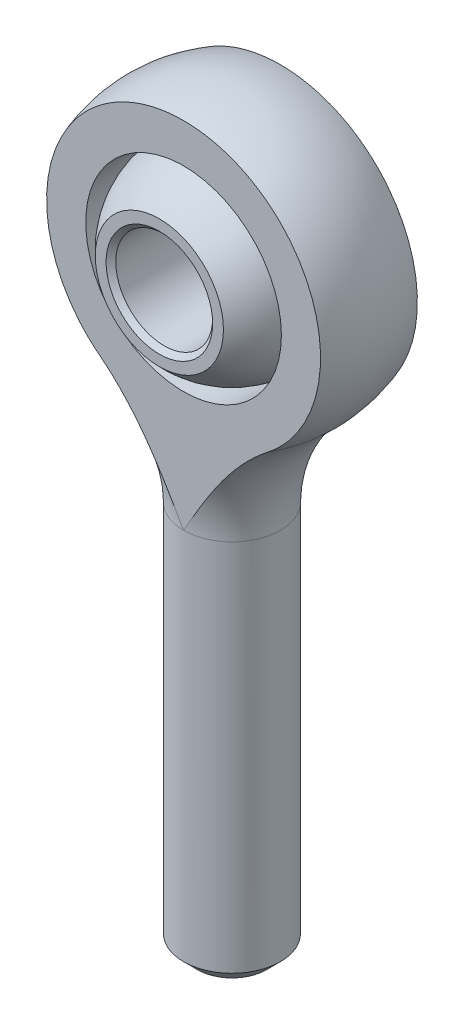
ISO-10303-21;
HEADER;
FILE_DESCRIPTION(('STEP AP214'),'2;1');
FILE_NAME('part.step','',(''),(''),'','','');
FILE_SCHEMA(('AUTOMOTIVE_DESIGN { 1 0 10303 214 1 1 1 1 }'));
ENDSEC;
DATA;
#1=APPLICATION_CONTEXT('core data for automotive mechanical design processes');
#2=APPLICATION_PROTOCOL_DEFINITION('international standard','automotive_design',2000,#1);
#3=PRODUCT_CONTEXT('',#1,'mechanical');
#4=PRODUCT('Part','Part','',(#3));
#5=PRODUCT_RELATED_PRODUCT_CATEGORY('part','',(#4));
#6=PRODUCT_DEFINITION_FORMATION('','',#4);
#7=PRODUCT_DEFINITION_CONTEXT('part definition',#1,'design');
#8=PRODUCT_DEFINITION('design','',#6,#7);
#9=PRODUCT_DEFINITION_SHAPE('','',#8);
#10=(LENGTH_UNIT() NAMED_UNIT(*) SI_UNIT(.MILLI.,.METRE.));
#11=(NAMED_UNIT(*) PLANE_ANGLE_UNIT() SI_UNIT($,.RADIAN.));
#12=(NAMED_UNIT(*) SI_UNIT($,.STERADIAN.) SOLID_ANGLE_UNIT());
#13=UNCERTAINTY_MEASURE_WITH_UNIT(LENGTH_MEASURE(1.E-05),#10,'distance_accuracy_value','');
#14=(GEOMETRIC_REPRESENTATION_CONTEXT(3) GLOBAL_UNCERTAINTY_ASSIGNED_CONTEXT((#13)) GLOBAL_UNIT_ASSIGNED_CONTEXT((#10,
#11,#12)) REPRESENTATION_CONTEXT('',''));
#15=CARTESIAN_POINT('',(0.,0.,0.));
#16=DIRECTION('',(0.,0.,1.));
#17=DIRECTION('',(1.,0.,0.));
#18=AXIS2_PLACEMENT_3D('',#15,#16,#17);
#19=CARTESIAN_POINT('',(0.,14.2875,0.));
#20=DIRECTION('',(0.,-1.,0.));
#21=DIRECTION('',(-1.,0.,0.));
#22=AXIS2_PLACEMENT_3D('',#19,#20,#21);
#23=SPHERICAL_SURFACE('',#22,6.35);
#24=CARTESIAN_POINT('',(0.,14.2875,0.));
#25=DIRECTION('',(0.,0.,1.));
#26=DIRECTION('',(0.,-1.,0.));
#27=AXIS2_PLACEMENT_3D('',#24,#25,#26);
#28=SPHERICAL_SURFACE('',#27,6.35);
#29=CARTESIAN_POINT('',(0.,14.2875,-4.7625));
#30=DIRECTION('',(0.,0.,1.));
#31=DIRECTION('',(0.,-1.,0.));
#32=AXIS2_PLACEMENT_3D('',#29,#30,#31);
#33=CIRCLE('',#32,4.20013020631504);
#34=CARTESIAN_POINT('',(0.,10.087369793685,-4.7625));
#35=VERTEX_POINT('',#34);
#36=EDGE_CURVE('E70',#35,#35,#33,.F.);
#37=ORIENTED_EDGE('',*,*,#36,.F.);
#38=EDGE_LOOP('',(#37));
#39=FACE_BOUND('',#38,.T.);
#40=CARTESIAN_POINT('',(0.,14.2875,4.7625));
#41=DIRECTION('',(0.,0.,-1.));
#42=DIRECTION('',(0.,1.,0.));
#43=AXIS2_PLACEMENT_3D('',#40,#41,#42);
#44=CIRCLE('',#43,4.20013020631504);
#45=CARTESIAN_POINT('',(0.,18.487630206315,4.7625));
#46=VERTEX_POINT('',#45);
#47=EDGE_CURVE('E69',#46,#46,#44,.F.);
#48=ORIENTED_EDGE('',*,*,#47,.F.);
#49=EDGE_LOOP('',(#48));
#50=FACE_BOUND('',#49,.T.);
#51=ADVANCED_FACE('F49',(#39,#50),#28,.T.);
#52=CARTESIAN_POINT('',(-9.525,23.8125,4.7625));
#53=DIRECTION('',(0.,0.,-1.));
#54=DIRECTION('',(0.,1.,0.));
#55=AXIS2_PLACEMENT_3D('',#52,#53,#54);
#56=PLANE('',#55);
#57=CARTESIAN_POINT('',(0.,14.2875,4.7625));
#58=DIRECTION('',(0.,0.,-1.));
#59=DIRECTION('',(0.,1.,0.));
#60=AXIS2_PLACEMENT_3D('',#57,#58,#59);
#61=CIRCLE('',#60,3.4925);
#62=CARTESIAN_POINT('',(0.,17.78,4.7625));
#63=VERTEX_POINT('',#62);
#64=EDGE_CURVE('E11',#63,#63,#61,.T.);
#65=ORIENTED_EDGE('',*,*,#64,.T.);
#66=EDGE_LOOP('',(#65));
#67=FACE_BOUND('',#66,.T.);
#68=ORIENTED_EDGE('',*,*,#47,.T.);
#69=EDGE_LOOP('',(#68));
#70=FACE_BOUND('',#69,.T.);
#71=ADVANCED_FACE('F76',(#67,#70),#56,.F.);
#72=CARTESIAN_POINT('',(-9.525,23.8125,-4.7625));
#73=DIRECTION('',(0.,0.,1.));
#74=DIRECTION('',(0.,-1.,0.));
#75=AXIS2_PLACEMENT_3D('',#72,#73,#74);
#76=PLANE('',#75);
#77=CARTESIAN_POINT('',(0.,14.2875,-4.7625));
#78=DIRECTION('',(0.,0.,1.));
#79=DIRECTION('',(0.,-1.,0.));
#80=AXIS2_PLACEMENT_3D('',#77,#78,#79);
#81=CIRCLE('',#80,3.4925);
#82=CARTESIAN_POINT('',(0.,10.795,-4.7625));
#83=VERTEX_POINT('',#82);
#84=EDGE_CURVE('E64',#83,#83,#81,.T.);
#85=ORIENTED_EDGE('',*,*,#84,.T.);
#86=EDGE_LOOP('',(#85));
#87=FACE_BOUND('',#86,.T.);
#88=ORIENTED_EDGE('',*,*,#36,.T.);
#89=EDGE_LOOP('',(#88));
#90=FACE_BOUND('',#89,.T.);
#91=ADVANCED_FACE('F84',(#87,#90),#76,.F.);
#92=CARTESIAN_POINT('',(0.,14.2875,-4.7625));
#93=DIRECTION('',(0.,0.,1.));
#94=DIRECTION('',(1.,0.,0.));
#95=AXIS2_PLACEMENT_3D('',#92,#93,#94);
#96=CYLINDRICAL_SURFACE('',#95,3.175);
#97=CARTESIAN_POINT('',(0.,14.2875,-4.445));
#98=DIRECTION('',(0.,0.,1.));
#99=DIRECTION('',(1.,0.,0.));
#100=AXIS2_PLACEMENT_3D('',#97,#98,#99);
#101=CIRCLE('',#100,3.175);
#102=CARTESIAN_POINT('',(3.175,14.2875,-4.445));
#103=VERTEX_POINT('',#102);
#104=EDGE_CURVE('E56',#103,#103,#101,.F.);
#105=ORIENTED_EDGE('',*,*,#104,.T.);
#106=EDGE_LOOP('',(#105));
#107=FACE_BOUND('',#106,.T.);
#108=CARTESIAN_POINT('',(0.,14.2875,4.445));
#109=DIRECTION('',(0.,0.,-1.));
#110=DIRECTION('',(-1.,0.,0.));
#111=AXIS2_PLACEMENT_3D('',#108,#109,#110);
#112=CIRCLE('',#111,3.175);
#113=CARTESIAN_POINT('',(-3.175,14.2875,4.445));
#114=VERTEX_POINT('',#113);
#115=EDGE_CURVE('E60',#114,#114,#112,.F.);
#116=ORIENTED_EDGE('',*,*,#115,.T.);
#117=EDGE_LOOP('',(#116));
#118=FACE_BOUND('',#117,.T.);
#119=ADVANCED_FACE('F90',(#107,#118),#96,.F.);
#120=CARTESIAN_POINT('',(0.,14.2875,-4.7625));
#121=DIRECTION('',(0.,0.,-1.));
#122=DIRECTION('',(-1.,0.,0.));
#123=AXIS2_PLACEMENT_3D('',#120,#121,#122);
#124=CONICAL_SURFACE('',#123,3.4925,0.785398163397446);
#125=ORIENTED_EDGE('',*,*,#104,.F.);
#126=EDGE_LOOP('',(#125));
#127=FACE_BOUND('',#126,.T.);
#128=ORIENTED_EDGE('',*,*,#84,.F.);
#129=EDGE_LOOP('',(#128));
#130=FACE_BOUND('',#129,.T.);
#131=ADVANCED_FACE('F88',(#127,#130),#124,.F.);
#132=CARTESIAN_POINT('',(0.,14.2875,4.445));
#133=DIRECTION('',(0.,0.,1.));
#134=DIRECTION('',(1.,0.,0.));
#135=AXIS2_PLACEMENT_3D('',#132,#133,#134);
#136=CONICAL_SURFACE('',#135,3.175,0.785398163397446);
#137=ORIENTED_EDGE('',*,*,#64,.F.);
#138=EDGE_LOOP('',(#137));
#139=FACE_BOUND('',#138,.T.);
#140=ORIENTED_EDGE('',*,*,#115,.F.);
#141=EDGE_LOOP('',(#140));
#142=FACE_BOUND('',#141,.T.);
#143=ADVANCED_FACE('F51',(#139,#142),#136,.F.);
#144=CLOSED_SHELL('',(#51,#71,#91,#119,#131,#143));
#145=MANIFOLD_SOLID_BREP('B2',#144);
#146=CARTESIAN_POINT('',(0.,0.,0.));
#147=DIRECTION('',(0.,-1.,0.));
#148=DIRECTION('',(1.,0.,0.));
#149=AXIS2_PLACEMENT_3D('',#146,#147,#148);
#150=TOROIDAL_SURFACE('',#149,12.8984375,9.72343750000001);
#151=CARTESIAN_POINT('',(0.,0.,-3.17500000000002));
#152=CARTESIAN_POINT('',(-0.00326153281441982,0.005707684580339,-3.17500000000001));
#153=CARTESIAN_POINT('',(-0.00652306728251784,0.0114153698422848,-3.17500000000001));
#154=CARTESIAN_POINT('',(-0.273129494536175,0.477974240188255,-3.17499999999953));
#155=CARTESIAN_POINT('',(-0.536560192717342,0.938786382521938,-3.17499999999987));
#156=CARTESIAN_POINT('',(-1.07566265442385,1.8532278541255,-3.17500000000012));
#157=CARTESIAN_POINT('',(-1.35133223128925,2.30685844699647,-3.17500000000003));
#158=CARTESIAN_POINT('',(-1.92559609450498,3.19894900735654,-3.17499999999996));
#159=CARTESIAN_POINT('',(-2.22416629507254,3.63742422890326,-3.17499999999998));
#160=CARTESIAN_POINT('',(-2.85309895646081,4.49102276291093,-3.175));
#161=CARTESIAN_POINT('',(-3.18344395182661,4.90615870752533,-3.17499999999999));
#162=CARTESIAN_POINT('',(-3.77466960931411,5.58162755367697,-3.17499999999999));
#163=CARTESIAN_POINT('',(-4.02585009176844,5.85044049930275,-3.17499999999999));
#164=CARTESIAN_POINT('',(-4.54711374431235,6.36901465439249,-3.17499999999999));
#165=CARTESIAN_POINT('',(-4.8171908837647,6.61878188936269,-3.17499999999999));
#166=CARTESIAN_POINT('',(-5.37662445754767,7.09612768098667,-3.17499999999999));
#167=CARTESIAN_POINT('',(-5.66599147564323,7.32369388511259,-3.17499999999998));
#168=CARTESIAN_POINT('',(-6.26322715779345,7.75319037776599,-3.17499999999998));
#169=CARTESIAN_POINT('',(-6.57109562059138,7.95512094508084,-3.17499999999998));
#170=CARTESIAN_POINT('',(-7.20718830556185,8.33213779588148,-3.17499999999998));
#171=CARTESIAN_POINT('',(-7.5355887374278,8.50692791175216,-3.17499999999998));
#172=CARTESIAN_POINT('',(-8.20771747693342,8.8241919306929,-3.17499999999998));
#173=CARTESIAN_POINT('',(-8.55144656933277,8.96666417695288,-3.17499999999998));
#174=CARTESIAN_POINT('',(-9.25110720245967,9.21656726408625,-3.17499999999998));
#175=CARTESIAN_POINT('',(-9.60702765373211,9.32402906223354,-3.17499999999998));
#176=CARTESIAN_POINT('',(-10.3280020283619,9.50191139492481,-3.17499999999998));
#177=CARTESIAN_POINT('',(-10.6930544049571,9.57233815853922,-3.17499999999998));
#178=CARTESIAN_POINT('',(-11.3741481179293,9.66696888097472,-3.17499999999998));
#179=CARTESIAN_POINT('',(-11.6894621097035,9.69646466999952,-3.17499999999998));
#180=CARTESIAN_POINT('',(-12.3214131947063,9.72667494727439,-3.17499999999998));
#181=CARTESIAN_POINT('',(-12.6380499893941,9.72739561225201,-3.17499999999998));
#182=CARTESIAN_POINT('',(-13.2714560118642,9.69958458822556,-3.17499999999998));
#183=CARTESIAN_POINT('',(-13.5882199940049,9.67092754783703,-3.17499999999998));
#184=CARTESIAN_POINT('',(-14.0603016310326,9.60580647491024,-3.17499999999998));
#185=CARTESIAN_POINT('',(-14.2172131666163,9.58039570300526,-3.17499999999998));
#186=CARTESIAN_POINT('',(-14.5296709919222,9.5222100530854,-3.17499999999998));
#187=CARTESIAN_POINT('',(-14.6852172275902,9.48943488485749,-3.17499999999998));
#188=CARTESIAN_POINT('',(-14.8399244090465,9.45298870970035,-3.17499999999998));
#189=B_SPLINE_CURVE_WITH_KNOTS('',3,(#151,#152,#153,#154,#155,#156,#157,#158,#159,#160,#161,
#162,#163,#164,#165,#166,#167,#168,#169,#170,#171,#172,#173,#174,#175,#176,#177,#178,#179,#180,
#181,#182,#183,#184,#185,#186,#187,#188),.UNSPECIFIED.,.F.,.F.,(4,2,2,2,2,2,2,2,2,2,2,2,2,2,2,2,
2,2,4),(0.,0.0197214984217777,1.6120807750934,3.20415668878455,4.79458050768029,
6.38413507018251,7.48699761805494,8.58950979223067,9.692631940663,10.7957420916219,
11.9101519429451,13.0246189127738,14.1380977463547,15.2513892395329,16.2001992988048,
17.1488056900493,18.1014765943213,18.5781908799006,19.0549239549309),.UNSPECIFIED.);
#190=CARTESIAN_POINT('',(0.,0.,-3.175));
#191=VERTEX_POINT('',#190);
#192=CARTESIAN_POINT('',(-5.53702467552869,7.21739690721651,-3.17499999999999));
#193=VERTEX_POINT('',#192);
#194=EDGE_CURVE('E143',#191,#193,#189,.T.);
#195=ORIENTED_EDGE('',*,*,#194,.F.);
#196=CARTESIAN_POINT('',(0.,0.,0.));
#197=DIRECTION('',(0.,1.,0.));
#198=DIRECTION('',(-1.,0.,0.));
#199=AXIS2_PLACEMENT_3D('',#196,#197,#198);
#200=CIRCLE('',#199,3.175);
#201=CARTESIAN_POINT('',(0.,0.,3.175));
#202=VERTEX_POINT('',#201);
#203=EDGE_CURVE('E171',#191,#202,#200,.T.);
#204=ORIENTED_EDGE('',*,*,#203,.T.);
#205=CARTESIAN_POINT('',(0.,0.,3.17500000000002));
#206=CARTESIAN_POINT('',(-0.00326153281468181,0.00570768458021034,3.17500000000001));
#207=CARTESIAN_POINT('',(-0.00652306728303626,0.0114153698420096,3.175));
#208=CARTESIAN_POINT('',(-0.273129494558281,0.477974240178135,3.17499999999949));
#209=CARTESIAN_POINT('',(-0.536560192725134,0.938786382522493,3.17499999999986));
#210=CARTESIAN_POINT('',(-1.07566265442257,1.853227854136,3.17500000000013));
#211=CARTESIAN_POINT('',(-1.35133223129322,2.30685844700624,3.17500000000003));
#212=CARTESIAN_POINT('',(-1.92559609451397,3.19894900736693,3.17499999999996));
#213=CARTESIAN_POINT('',(-2.22416629508128,3.63742422891501,3.17499999999999));
#214=CARTESIAN_POINT('',(-2.85309895647092,4.49102276292478,3.17500000000001));
#215=CARTESIAN_POINT('',(-3.18344395183838,4.90615870753989,3.175));
#216=CARTESIAN_POINT('',(-3.77466960932724,5.58162755369122,3.175));
#217=CARTESIAN_POINT('',(-4.02585009178125,5.85044049931608,3.175));
#218=CARTESIAN_POINT('',(-4.54711374432451,6.36901465440402,3.175));
#219=CARTESIAN_POINT('',(-4.81719088377654,6.61878188937333,3.175));
#220=CARTESIAN_POINT('',(-5.37662445755933,7.0961276809961,3.175));
#221=CARTESIAN_POINT('',(-5.66599147565507,7.32369388512163,3.175));
#222=CARTESIAN_POINT('',(-6.26322715780569,7.75319037777427,3.175));
#223=CARTESIAN_POINT('',(-6.57109562060384,7.95512094508875,3.175));
#224=CARTESIAN_POINT('',(-7.20718830557456,8.33213779588849,3.175));
#225=CARTESIAN_POINT('',(-7.53558873744053,8.50692791175866,3.175));
#226=CARTESIAN_POINT('',(-8.2077174769461,8.82419193069839,3.175));
#227=CARTESIAN_POINT('',(-8.5514465693454,8.96666417695786,3.175));
#228=CARTESIAN_POINT('',(-9.25110720247167,9.21656726409007,3.175));
#229=CARTESIAN_POINT('',(-9.60702765374351,9.32402906223675,3.175));
#230=CARTESIAN_POINT('',(-10.328002028372,9.50191139492693,3.175));
#231=CARTESIAN_POINT('',(-10.6930544049666,9.57233815854086,3.175));
#232=CARTESIAN_POINT('',(-11.3741481179378,9.66696888097564,3.175));
#233=CARTESIAN_POINT('',(-11.6894621097117,9.69646467000015,3.175));
#234=CARTESIAN_POINT('',(-12.3214131947137,9.72667494727451,3.175));
#235=CARTESIAN_POINT('',(-12.6380499894011,9.72739561225191,3.175));
#236=CARTESIAN_POINT('',(-13.2714560118709,9.69958458822505,3.175));
#237=CARTESIAN_POINT('',(-13.5882199940118,9.67092754783631,3.175));
#238=CARTESIAN_POINT('',(-14.0603016310397,9.60580647490916,3.175));
#239=CARTESIAN_POINT('',(-14.2172131666234,9.58039570300406,3.175));
#240=CARTESIAN_POINT('',(-14.5296709919294,9.52221005308395,3.175));
#241=CARTESIAN_POINT('',(-14.6852172275975,9.48943488485591,3.175));
#242=CARTESIAN_POINT('',(-14.8399244090537,9.45298870969864,3.175));
#243=B_SPLINE_CURVE_WITH_KNOTS('',3,(#205,#206,#207,#208,#209,#210,#211,#212,#213,#214,#215,
#216,#217,#218,#219,#220,#221,#222,#223,#224,#225,#226,#227,#228,#229,#230,#231,#232,#233,#234,
#235,#236,#237,#238,#239,#240,#241,#242),.UNSPECIFIED.,.F.,.F.,(4,2,2,2,2,2,2,2,2,2,2,2,2,2,2,2,
2,2,4),(0.,0.0197214984217777,1.61208077509989,3.20415668879695,4.79458050769593,
6.38413507020272,7.48699761807251,8.58950979224571,9.69263194067777,10.7957420916366,
11.9101519429592,13.0246189127871,14.1380977463658,15.2513892395418,16.2001992988125,
17.1488056900559,18.1014765943283,18.5781908799078,19.0549239549384),.UNSPECIFIED.);
#244=CARTESIAN_POINT('',(-5.53702467552869,7.21739690721651,3.175));
#245=VERTEX_POINT('',#244);
#246=EDGE_CURVE('E175',#245,#202,#243,.F.);
#247=ORIENTED_EDGE('',*,*,#246,.F.);
#248=CARTESIAN_POINT('',(0.,7.21739690721651,0.));
#249=DIRECTION('',(0.,-1.,0.));
#250=DIRECTION('',(1.,0.,0.));
#251=AXIS2_PLACEMENT_3D('',#248,#249,#250);
#252=CIRCLE('',#251,6.38273195876291);
#253=EDGE_CURVE('E174',#245,#193,#252,.T.);
#254=ORIENTED_EDGE('',*,*,#253,.T.);
#255=EDGE_LOOP('',(#195,#204,#247,#254));
#256=FACE_BOUND('',#255,.T.);
#257=ADVANCED_FACE('F129',(#256),#150,.F.);
#258=CARTESIAN_POINT('',(0.,-25.4,0.));
#259=DIRECTION('',(0.,1.,0.));
#260=DIRECTION('',(-1.,0.,0.));
#261=AXIS2_PLACEMENT_3D('',#258,#259,#260);
#262=PLANE('',#261);
#263=CARTESIAN_POINT('',(0.,-25.4,0.));
#264=DIRECTION('',(0.,1.,0.));
#265=DIRECTION('',(-1.,0.,0.));
#266=AXIS2_PLACEMENT_3D('',#263,#264,#265);
#267=CIRCLE('',#266,2.26822);
#268=CARTESIAN_POINT('',(-2.26822,-25.4,0.));
#269=VERTEX_POINT('',#268);
#270=EDGE_CURVE('E186',#269,#269,#267,.F.);
#271=ORIENTED_EDGE('',*,*,#270,.T.);
#272=EDGE_LOOP('',(#271));
#273=FACE_BOUND('',#272,.T.);
#274=ADVANCED_FACE('F223',(#273),#262,.F.);
#275=CARTESIAN_POINT('',(0.,23.8125,0.));
#276=DIRECTION('',(0.,1.,0.));
#277=DIRECTION('',(-1.,0.,0.));
#278=AXIS2_PLACEMENT_3D('',#275,#276,#277);
#279=CYLINDRICAL_SURFACE('',#278,3.175);
#280=CARTESIAN_POINT('',(0.,-24.49322,0.));
#281=DIRECTION('',(0.,1.,0.));
#282=DIRECTION('',(-1.,0.,0.));
#283=AXIS2_PLACEMENT_3D('',#280,#281,#282);
#284=CIRCLE('',#283,3.175);
#285=CARTESIAN_POINT('',(-3.175,-24.49322,0.));
#286=VERTEX_POINT('',#285);
#287=EDGE_CURVE('E184',#286,#286,#284,.T.);
#288=ORIENTED_EDGE('',*,*,#287,.T.);
#289=EDGE_LOOP('',(#288));
#290=FACE_BOUND('',#289,.T.);
#291=EDGE_CURVE('E180',#202,#191,#200,.T.);
#292=ORIENTED_EDGE('',*,*,#291,.F.);
#293=ORIENTED_EDGE('',*,*,#203,.F.);
#294=EDGE_LOOP('',(#292,#293));
#295=FACE_BOUND('',#294,.T.);
#296=ADVANCED_FACE('F179',(#290,#295),#279,.T.);
#297=CARTESIAN_POINT('',(0.,-24.49322,0.));
#298=DIRECTION('',(0.,1.,0.));
#299=DIRECTION('',(-1.,0.,0.));
#300=AXIS2_PLACEMENT_3D('',#297,#298,#299);
#301=CONICAL_SURFACE('',#300,3.175,0.785398163397451);
#302=ORIENTED_EDGE('',*,*,#270,.F.);
#303=EDGE_LOOP('',(#302));
#304=FACE_BOUND('',#303,.T.);
#305=ORIENTED_EDGE('',*,*,#287,.F.);
#306=EDGE_LOOP('',(#305));
#307=FACE_BOUND('',#306,.T.);
#308=ADVANCED_FACE('F131',(#304,#307),#301,.T.);
#309=CARTESIAN_POINT('',(0.,0.,-3.17500000000002));
#310=CARTESIAN_POINT('',(0.00326153281435391,0.005707684580339,-3.17500000000001));
#311=CARTESIAN_POINT('',(0.00652306728245195,0.0114153698422848,-3.17500000000001));
#312=CARTESIAN_POINT('',(0.273129494536111,0.477974240188253,-3.17499999999953));
#313=CARTESIAN_POINT('',(0.536560192717282,0.938786382521935,-3.17499999999987));
#314=CARTESIAN_POINT('',(1.07566265442379,1.8532278541255,-3.17500000000012));
#315=CARTESIAN_POINT('',(1.35133223128919,2.30685844699646,-3.17500000000003));
#316=CARTESIAN_POINT('',(1.92559609450492,3.19894900735654,-3.17499999999996));
#317=CARTESIAN_POINT('',(2.22416629507248,3.63742422890325,-3.17499999999998));
#318=CARTESIAN_POINT('',(2.85309895646076,4.49102276291092,-3.175));
#319=CARTESIAN_POINT('',(3.18344395182656,4.90615870752532,-3.17499999999999));
#320=CARTESIAN_POINT('',(3.77466960931405,5.58162755367696,-3.17499999999999));
#321=CARTESIAN_POINT('',(4.02585009176839,5.85044049930274,-3.17499999999999));
#322=CARTESIAN_POINT('',(4.54711374431229,6.36901465439248,-3.17499999999999));
#323=CARTESIAN_POINT('',(4.81719088376465,6.61878188936267,-3.17499999999999));
#324=CARTESIAN_POINT('',(5.37662445754762,7.09612768098666,-3.17499999999999));
#325=CARTESIAN_POINT('',(5.66599147564318,7.32369388511257,-3.17499999999998));
#326=CARTESIAN_POINT('',(6.2632271577934,7.75319037776597,-3.17499999999998));
#327=CARTESIAN_POINT('',(6.57109562059133,7.95512094508082,-3.17499999999998));
#328=CARTESIAN_POINT('',(7.2071883055618,8.33213779588146,-3.17499999999998));
#329=CARTESIAN_POINT('',(7.53558873742776,8.50692791175213,-3.17499999999998));
#330=CARTESIAN_POINT('',(8.20771747693337,8.82419193069288,-3.17499999999998));
#331=CARTESIAN_POINT('',(8.55144656933273,8.96666417695286,-3.17499999999998));
#332=CARTESIAN_POINT('',(9.25110720245962,9.21656726408623,-3.17499999999998));
#333=CARTESIAN_POINT('',(9.60702765373206,9.32402906223352,-3.17499999999998));
#334=CARTESIAN_POINT('',(10.3280020283618,9.50191139492478,-3.17499999999998));
#335=CARTESIAN_POINT('',(10.6930544049571,9.57233815853919,-3.17499999999998));
#336=CARTESIAN_POINT('',(11.3741481179293,9.6669688809747,-3.17499999999998));
#337=CARTESIAN_POINT('',(11.6894621097035,9.69646466999949,-3.17499999999998));
#338=CARTESIAN_POINT('',(12.3214131947063,9.72667494727436,-3.17499999999998));
#339=CARTESIAN_POINT('',(12.638049989394,9.72739561225198,-3.17499999999998));
#340=CARTESIAN_POINT('',(13.2714560118641,9.69958458822553,-3.17499999999998));
#341=CARTESIAN_POINT('',(13.5882199940049,9.670927547837,-3.17499999999998));
#342=CARTESIAN_POINT('',(14.0603016310326,9.60580647491021,-3.17499999999998));
#343=CARTESIAN_POINT('',(14.2172131666163,9.58039570300523,-3.17499999999998));
#344=CARTESIAN_POINT('',(14.5296709919222,9.52221005308536,-3.17499999999998));
#345=CARTESIAN_POINT('',(14.6852172275902,9.48943488485746,-3.17499999999998));
#346=CARTESIAN_POINT('',(14.8399244090464,9.45298870970032,-3.17499999999998));
#347=B_SPLINE_CURVE_WITH_KNOTS('',3,(#309,#310,#311,#312,#313,#314,#315,#316,#317,#318,#319,
#320,#321,#322,#323,#324,#325,#326,#327,#328,#329,#330,#331,#332,#333,#334,#335,#336,#337,#338,
#339,#340,#341,#342,#343,#344,#345,#346),.UNSPECIFIED.,.F.,.F.,(4,2,2,2,2,2,2,2,2,2,2,2,2,2,2,2,
2,2,4),(0.,0.0197214984217777,1.6120807750934,3.20415668878455,4.79458050768028,
6.38413507018251,7.48699761805494,8.58950979223066,9.692631940663,10.7957420916219,
11.9101519429451,13.0246189127738,14.1380977463547,15.2513892395329,16.2001992988048,
17.1488056900493,18.1014765943213,18.5781908799006,19.0549239549309),.UNSPECIFIED.);
#348=CARTESIAN_POINT('',(5.53702467552866,7.2173969072165,-3.17499999999999));
#349=VERTEX_POINT('',#348);
#350=EDGE_CURVE('E162',#349,#191,#347,.F.);
#351=ORIENTED_EDGE('',*,*,#350,.F.);
#352=CARTESIAN_POINT('',(5.53702467552865,7.2173969072165,3.175));
#353=VERTEX_POINT('',#352);
#354=EDGE_CURVE('E151',#349,#353,#252,.T.);
#355=ORIENTED_EDGE('',*,*,#354,.T.);
#356=CARTESIAN_POINT('',(0.,0.,3.17500000000002));
#357=CARTESIAN_POINT('',(0.0032615328146159,0.00570768458021033,3.17500000000001));
#358=CARTESIAN_POINT('',(0.00652306728297037,0.0114153698420096,3.175));
#359=CARTESIAN_POINT('',(0.273129494558217,0.477974240178134,3.17499999999949));
#360=CARTESIAN_POINT('',(0.536560192725071,0.938786382522491,3.17499999999986));
#361=CARTESIAN_POINT('',(1.07566265442251,1.853227854136,3.17500000000013));
#362=CARTESIAN_POINT('',(1.35133223129316,2.30685844700623,3.17500000000003));
#363=CARTESIAN_POINT('',(1.92559609451392,3.19894900736692,3.17499999999996));
#364=CARTESIAN_POINT('',(2.22416629508122,3.637424228915,3.17499999999999));
#365=CARTESIAN_POINT('',(2.85309895647086,4.49102276292477,3.17500000000001));
#366=CARTESIAN_POINT('',(3.18344395183832,4.90615870753988,3.175));
#367=CARTESIAN_POINT('',(3.77466960932719,5.58162755369121,3.175));
#368=CARTESIAN_POINT('',(4.0258500917812,5.85044049931607,3.175));
#369=CARTESIAN_POINT('',(4.54711374432446,6.36901465440401,3.175));
#370=CARTESIAN_POINT('',(4.81719088377649,6.61878188937332,3.175));
#371=CARTESIAN_POINT('',(5.37662445755928,7.09612768099608,3.175));
#372=CARTESIAN_POINT('',(5.66599147565502,7.32369388512161,3.175));
#373=CARTESIAN_POINT('',(6.26322715780564,7.75319037777425,3.175));
#374=CARTESIAN_POINT('',(6.57109562060379,7.95512094508873,3.175));
#375=CARTESIAN_POINT('',(7.20718830557451,8.33213779588848,3.175));
#376=CARTESIAN_POINT('',(7.53558873744048,8.50692791175864,3.175));
#377=CARTESIAN_POINT('',(8.20771747694606,8.82419193069837,3.175));
#378=CARTESIAN_POINT('',(8.55144656934536,8.96666417695784,3.175));
#379=CARTESIAN_POINT('',(9.25110720247162,9.21656726409005,3.175));
#380=CARTESIAN_POINT('',(9.60702765374347,9.32402906223672,3.175));
#381=CARTESIAN_POINT('',(10.328002028372,9.5019113949269,3.175));
#382=CARTESIAN_POINT('',(10.6930544049666,9.57233815854083,3.175));
#383=CARTESIAN_POINT('',(11.3741481179378,9.66696888097561,3.175));
#384=CARTESIAN_POINT('',(11.6894621097116,9.69646467000012,3.175));
#385=CARTESIAN_POINT('',(12.3214131947137,9.72667494727447,3.175));
#386=CARTESIAN_POINT('',(12.638049989401,9.72739561225188,3.175));
#387=CARTESIAN_POINT('',(13.2714560118709,9.69958458822503,3.175));
#388=CARTESIAN_POINT('',(13.5882199940117,9.67092754783627,3.175));
#389=CARTESIAN_POINT('',(14.0603016310396,9.60580647490912,3.175));
#390=CARTESIAN_POINT('',(14.2172131666233,9.58039570300403,3.175));
#391=CARTESIAN_POINT('',(14.5296709919293,9.52221005308391,3.175));
#392=CARTESIAN_POINT('',(14.6852172275974,9.48943488485587,3.175));
#393=CARTESIAN_POINT('',(14.8399244090537,9.45298870969861,3.175));
#394=B_SPLINE_CURVE_WITH_KNOTS('',3,(#356,#357,#358,#359,#360,#361,#362,#363,#364,#365,#366,
#367,#368,#369,#370,#371,#372,#373,#374,#375,#376,#377,#378,#379,#380,#381,#382,#383,#384,#385,
#386,#387,#388,#389,#390,#391,#392,#393),.UNSPECIFIED.,.F.,.F.,(4,2,2,2,2,2,2,2,2,2,2,2,2,2,2,2,
2,2,4),(0.,0.0197214984217777,1.61208077509989,3.20415668879695,4.79458050769593,
6.38413507020272,7.48699761807251,8.58950979224571,9.69263194067777,10.7957420916366,
11.9101519429592,13.0246189127871,14.1380977463658,15.2513892395418,16.2001992988125,
17.1488056900559,18.1014765943283,18.5781908799078,19.0549239549384),.UNSPECIFIED.);
#395=EDGE_CURVE('E183',#202,#353,#394,.T.);
#396=ORIENTED_EDGE('',*,*,#395,.F.);
#397=ORIENTED_EDGE('',*,*,#291,.T.);
#398=EDGE_LOOP('',(#351,#355,#396,#397));
#399=FACE_BOUND('',#398,.T.);
#400=ADVANCED_FACE('F182',(#399),#150,.F.);
#401=CARTESIAN_POINT('',(0.,14.2875,0.));
#402=DIRECTION('',(0.,-1.,0.));
#403=DIRECTION('',(1.,0.,0.));
#404=AXIS2_PLACEMENT_3D('',#401,#402,#403);
#405=SPHERICAL_SURFACE('',#404,9.525);
#406=CARTESIAN_POINT('',(0.,14.2875,-3.17499999999997));
#407=DIRECTION('',(0.,0.,1.));
#408=DIRECTION('',(0.,-1.,0.));
#409=AXIS2_PLACEMENT_3D('',#406,#407,#408);
#410=CIRCLE('',#409,8.98025612106916);
#411=EDGE_CURVE('E47',#193,#349,#410,.F.);
#412=ORIENTED_EDGE('',*,*,#411,.F.);
#413=ORIENTED_EDGE('',*,*,#253,.F.);
#414=CARTESIAN_POINT('',(0.,14.2875,3.175));
#415=DIRECTION('',(0.,0.,-1.));
#416=DIRECTION('',(0.,1.,0.));
#417=AXIS2_PLACEMENT_3D('',#414,#415,#416);
#418=CIRCLE('',#417,8.98025612106915);
#419=EDGE_CURVE('E137',#353,#245,#418,.F.);
#420=ORIENTED_EDGE('',*,*,#419,.F.);
#421=ORIENTED_EDGE('',*,*,#354,.F.);
#422=EDGE_LOOP('',(#412,#413,#420,#421));
#423=FACE_BOUND('',#422,.T.);
#424=ADVANCED_FACE('F197',(#423),#405,.T.);
#425=CARTESIAN_POINT('',(-9.525,23.8125,3.175));
#426=DIRECTION('',(0.,0.,-1.));
#427=DIRECTION('',(0.,1.,0.));
#428=AXIS2_PLACEMENT_3D('',#425,#426,#427);
#429=PLANE('',#428);
#430=CARTESIAN_POINT('',(0.,14.2875,3.175));
#431=DIRECTION('',(0.,0.,1.));
#432=DIRECTION('',(1.,0.,0.));
#433=AXIS2_PLACEMENT_3D('',#430,#431,#432);
#434=CIRCLE('',#433,6.4135);
#435=CARTESIAN_POINT('',(6.4135,14.2875,3.175));
#436=VERTEX_POINT('',#435);
#437=EDGE_CURVE('E280',#436,#436,#434,.T.);
#438=ORIENTED_EDGE('',*,*,#437,.F.);
#439=EDGE_LOOP('',(#438));
#440=FACE_BOUND('',#439,.T.);
#441=ORIENTED_EDGE('',*,*,#395,.T.);
#442=ORIENTED_EDGE('',*,*,#419,.T.);
#443=ORIENTED_EDGE('',*,*,#246,.T.);
#444=EDGE_LOOP('',(#441,#442,#443));
#445=FACE_BOUND('',#444,.T.);
#446=ADVANCED_FACE('F194',(#440,#445),#429,.F.);
#447=CARTESIAN_POINT('',(-9.525,0.,-3.175));
#448=DIRECTION('',(0.,0.,1.));
#449=DIRECTION('',(0.,-1.,0.));
#450=AXIS2_PLACEMENT_3D('',#447,#448,#449);
#451=PLANE('',#450);
#452=CARTESIAN_POINT('',(0.,14.2875,-3.175));
#453=DIRECTION('',(0.,0.,1.));
#454=DIRECTION('',(1.,0.,0.));
#455=AXIS2_PLACEMENT_3D('',#452,#453,#454);
#456=CIRCLE('',#455,6.4135);
#457=CARTESIAN_POINT('',(6.4135,14.2875,-3.175));
#458=VERTEX_POINT('',#457);
#459=EDGE_CURVE('E165',#458,#458,#456,.T.);
#460=ORIENTED_EDGE('',*,*,#459,.T.);
#461=EDGE_LOOP('',(#460));
#462=FACE_BOUND('',#461,.T.);
#463=ORIENTED_EDGE('',*,*,#194,.T.);
#464=ORIENTED_EDGE('',*,*,#411,.T.);
#465=ORIENTED_EDGE('',*,*,#350,.T.);
#466=EDGE_LOOP('',(#463,#464,#465));
#467=FACE_BOUND('',#466,.T.);
#468=ADVANCED_FACE('F163',(#462,#467),#451,.F.);
#469=CARTESIAN_POINT('',(0.,14.2875,-3.175));
#470=DIRECTION('',(0.,0.,1.));
#471=DIRECTION('',(1.,0.,0.));
#472=AXIS2_PLACEMENT_3D('',#469,#470,#471);
#473=CYLINDRICAL_SURFACE('',#472,6.4135);
#474=ORIENTED_EDGE('',*,*,#459,.F.);
#475=EDGE_LOOP('',(#474));
#476=FACE_BOUND('',#475,.T.);
#477=ORIENTED_EDGE('',*,*,#437,.T.);
#478=EDGE_LOOP('',(#477));
#479=FACE_BOUND('',#478,.T.);
#480=ADVANCED_FACE('F264',(#476,#479),#473,.F.);
#481=CLOSED_SHELL('',(#257,#274,#296,#308,#400,#424,#446,#468,#480));
#482=MANIFOLD_SOLID_BREP('B6',#481);
#483=ADVANCED_BREP_SHAPE_REPRESENTATION('',(#18,#145,#482),#14);
#484=SHAPE_DEFINITION_REPRESENTATION(#9,#483);
ENDSEC;
END-ISO-10303-21;
